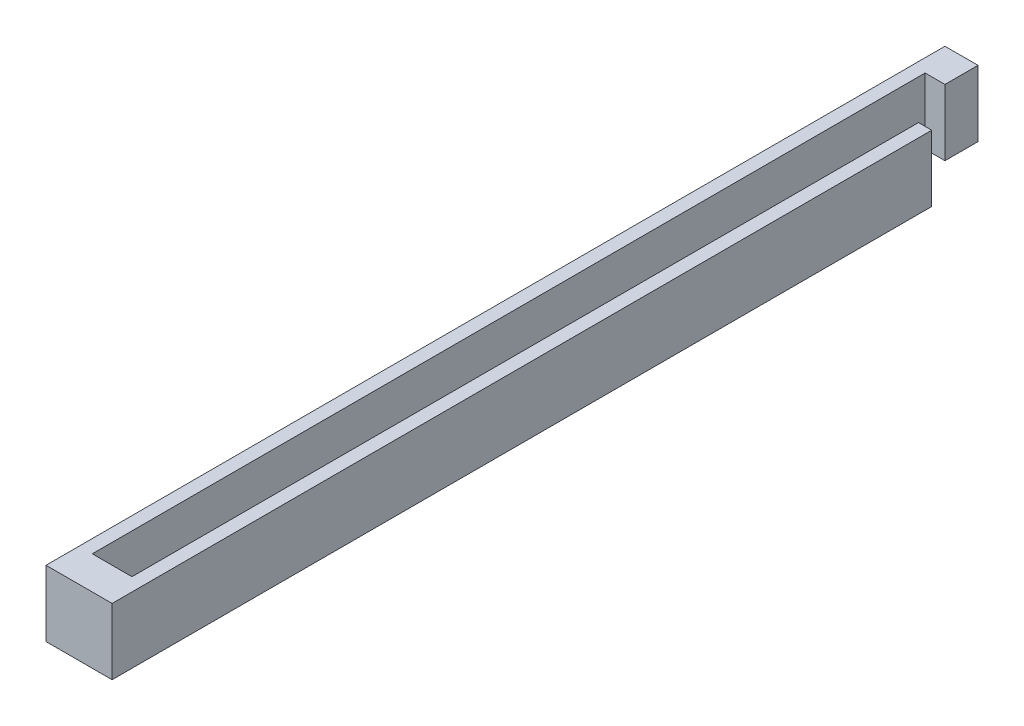
ISO-10303-21;
HEADER;
FILE_DESCRIPTION(('STEP AP214'),'2;1');
FILE_NAME('part.step','',(''),(''),'','','');
FILE_SCHEMA(('AUTOMOTIVE_DESIGN { 1 0 10303 214 1 1 1 1 }'));
ENDSEC;
DATA;
#1=APPLICATION_CONTEXT('core data for automotive mechanical design processes');
#2=APPLICATION_PROTOCOL_DEFINITION('international standard','automotive_design',2000,#1);
#3=PRODUCT_CONTEXT('',#1,'mechanical');
#4=PRODUCT('Part','Part','',(#3));
#5=PRODUCT_RELATED_PRODUCT_CATEGORY('part','',(#4));
#6=PRODUCT_DEFINITION_FORMATION('','',#4);
#7=PRODUCT_DEFINITION_CONTEXT('part definition',#1,'design');
#8=PRODUCT_DEFINITION('design','',#6,#7);
#9=PRODUCT_DEFINITION_SHAPE('','',#8);
#10=(LENGTH_UNIT() NAMED_UNIT(*) SI_UNIT(.MILLI.,.METRE.));
#11=(NAMED_UNIT(*) PLANE_ANGLE_UNIT() SI_UNIT($,.RADIAN.));
#12=(NAMED_UNIT(*) SI_UNIT($,.STERADIAN.) SOLID_ANGLE_UNIT());
#13=UNCERTAINTY_MEASURE_WITH_UNIT(LENGTH_MEASURE(1.E-05),#10,'distance_accuracy_value','');
#14=(GEOMETRIC_REPRESENTATION_CONTEXT(3) GLOBAL_UNCERTAINTY_ASSIGNED_CONTEXT((#13)) GLOBAL_UNIT_ASSIGNED_CONTEXT((#10,
#11,#12)) REPRESENTATION_CONTEXT('',''));
#15=CARTESIAN_POINT('',(0.,0.,0.));
#16=DIRECTION('',(0.,0.,1.));
#17=DIRECTION('',(1.,0.,0.));
#18=AXIS2_PLACEMENT_3D('',#15,#16,#17);
#19=CARTESIAN_POINT('',(5.,10.,-68.));
#20=DIRECTION('',(0.,0.,1.));
#21=DIRECTION('',(1.,0.,0.));
#22=AXIS2_PLACEMENT_3D('',#19,#20,#21);
#23=PLANE('',#22);
#24=DIRECTION('',(0.,-1.,0.));
#25=VECTOR('',#24,1.);
#26=CARTESIAN_POINT('',(0.,10.,-68.));
#27=LINE('',#26,#25);
#28=CARTESIAN_POINT('',(0.,10.,-68.));
#29=VERTEX_POINT('',#28);
#30=CARTESIAN_POINT('',(0.,0.,-68.));
#31=VERTEX_POINT('',#30);
#32=EDGE_CURVE('E164',#29,#31,#27,.T.);
#33=ORIENTED_EDGE('',*,*,#32,.T.);
#34=DIRECTION('',(-1.,0.,0.));
#35=VECTOR('',#34,1.);
#36=CARTESIAN_POINT('',(5.,0.,-68.));
#37=LINE('',#36,#35);
#38=CARTESIAN_POINT('',(-5.,0.,-68.));
#39=VERTEX_POINT('',#38);
#40=EDGE_CURVE('E132',#31,#39,#37,.T.);
#41=ORIENTED_EDGE('',*,*,#40,.T.);
#42=DIRECTION('',(0.,-1.,0.));
#43=VECTOR('',#42,1.);
#44=CARTESIAN_POINT('',(-5.,10.,-68.));
#45=LINE('',#44,#43);
#46=CARTESIAN_POINT('',(-5.,10.,-68.));
#47=VERTEX_POINT('',#46);
#48=EDGE_CURVE('E141',#47,#39,#45,.T.);
#49=ORIENTED_EDGE('',*,*,#48,.F.);
#50=DIRECTION('',(-1.,0.,0.));
#51=VECTOR('',#50,1.);
#52=CARTESIAN_POINT('',(5.,10.,-68.));
#53=LINE('',#52,#51);
#54=EDGE_CURVE('E143',#29,#47,#53,.T.);
#55=ORIENTED_EDGE('',*,*,#54,.F.);
#56=EDGE_LOOP('',(#33,#41,#49,#55));
#57=FACE_BOUND('',#56,.T.);
#58=ADVANCED_FACE('F34',(#57),#23,.F.);
#59=CARTESIAN_POINT('',(0.,10.,0.));
#60=DIRECTION('',(0.,1.,0.));
#61=DIRECTION('',(0.,0.,1.));
#62=AXIS2_PLACEMENT_3D('',#59,#60,#61);
#63=PLANE('',#62);
#64=DIRECTION('',(1.,0.,0.));
#65=VECTOR('',#64,1.);
#66=CARTESIAN_POINT('',(3.,10.,-56.));
#67=LINE('',#66,#65);
#68=CARTESIAN_POINT('',(3.,10.,-56.));
#69=VERTEX_POINT('',#68);
#70=CARTESIAN_POINT('',(5.,10.,-56.));
#71=VERTEX_POINT('',#70);
#72=EDGE_CURVE('E114',#69,#71,#67,.T.);
#73=ORIENTED_EDGE('',*,*,#72,.F.);
#74=DIRECTION('',(0.,0.,-1.));
#75=VECTOR('',#74,1.);
#76=CARTESIAN_POINT('',(3.,10.,63.));
#77=LINE('',#76,#75);
#78=CARTESIAN_POINT('',(3.,10.,63.));
#79=VERTEX_POINT('',#78);
#80=EDGE_CURVE('E195',#79,#69,#77,.T.);
#81=ORIENTED_EDGE('',*,*,#80,.F.);
#82=DIRECTION('',(1.,0.,0.));
#83=VECTOR('',#82,1.);
#84=CARTESIAN_POINT('',(0.,10.,63.));
#85=LINE('',#84,#83);
#86=CARTESIAN_POINT('',(-3.,10.,63.));
#87=VERTEX_POINT('',#86);
#88=EDGE_CURVE('E198',#87,#79,#85,.T.);
#89=ORIENTED_EDGE('',*,*,#88,.F.);
#90=DIRECTION('',(0.,0.,1.));
#91=VECTOR('',#90,1.);
#92=CARTESIAN_POINT('',(-3.,10.,63.));
#93=LINE('',#92,#91);
#94=CARTESIAN_POINT('',(-3.,10.,-63.));
#95=VERTEX_POINT('',#94);
#96=EDGE_CURVE('E186',#95,#87,#93,.T.);
#97=ORIENTED_EDGE('',*,*,#96,.F.);
#98=DIRECTION('',(-1.,0.,0.));
#99=VECTOR('',#98,1.);
#100=CARTESIAN_POINT('',(0.,10.,-63.));
#101=LINE('',#100,#99);
#102=CARTESIAN_POINT('',(0.,10.,-63.));
#103=VERTEX_POINT('',#102);
#104=EDGE_CURVE('E183',#103,#95,#101,.T.);
#105=ORIENTED_EDGE('',*,*,#104,.F.);
#106=DIRECTION('',(0.,0.,1.));
#107=VECTOR('',#106,1.);
#108=CARTESIAN_POINT('',(0.,10.,-63.));
#109=LINE('',#108,#107);
#110=EDGE_CURVE('E193',#29,#103,#109,.T.);
#111=ORIENTED_EDGE('',*,*,#110,.F.);
#112=ORIENTED_EDGE('',*,*,#54,.T.);
#113=DIRECTION('',(0.,0.,1.));
#114=VECTOR('',#113,1.);
#115=CARTESIAN_POINT('',(-5.,10.,68.));
#116=LINE('',#115,#114);
#117=CARTESIAN_POINT('',(-5.,10.,68.));
#118=VERTEX_POINT('',#117);
#119=EDGE_CURVE('E135',#47,#118,#116,.T.);
#120=ORIENTED_EDGE('',*,*,#119,.T.);
#121=DIRECTION('',(1.,0.,0.));
#122=VECTOR('',#121,1.);
#123=CARTESIAN_POINT('',(5.,10.,68.));
#124=LINE('',#123,#122);
#125=CARTESIAN_POINT('',(5.,10.,68.));
#126=VERTEX_POINT('',#125);
#127=EDGE_CURVE('E155',#118,#126,#124,.T.);
#128=ORIENTED_EDGE('',*,*,#127,.T.);
#129=DIRECTION('',(0.,0.,-1.));
#130=VECTOR('',#129,1.);
#131=CARTESIAN_POINT('',(5.,10.,68.));
#132=LINE('',#131,#130);
#133=EDGE_CURVE('E149',#126,#71,#132,.T.);
#134=ORIENTED_EDGE('',*,*,#133,.T.);
#135=EDGE_LOOP('',(#73,#81,#89,#97,#105,#111,#112,#120,#128,#134));
#136=FACE_BOUND('',#135,.T.);
#137=ADVANCED_FACE('F168',(#136),#63,.T.);
#138=CARTESIAN_POINT('',(0.,0.,0.));
#139=DIRECTION('',(0.,1.,0.));
#140=DIRECTION('',(0.,0.,1.));
#141=AXIS2_PLACEMENT_3D('',#138,#139,#140);
#142=PLANE('',#141);
#143=DIRECTION('',(0.,0.,-1.));
#144=VECTOR('',#143,1.);
#145=CARTESIAN_POINT('',(3.,0.,-63.));
#146=LINE('',#145,#144);
#147=CARTESIAN_POINT('',(3.,0.,63.));
#148=VERTEX_POINT('',#147);
#149=CARTESIAN_POINT('',(3.,0.,-56.));
#150=VERTEX_POINT('',#149);
#151=EDGE_CURVE('E127',#148,#150,#146,.T.);
#152=ORIENTED_EDGE('',*,*,#151,.T.);
#153=DIRECTION('',(1.,0.,0.));
#154=VECTOR('',#153,1.);
#155=CARTESIAN_POINT('',(3.,0.,-56.));
#156=LINE('',#155,#154);
#157=CARTESIAN_POINT('',(5.,0.,-56.));
#158=VERTEX_POINT('',#157);
#159=EDGE_CURVE('E49',#150,#158,#156,.T.);
#160=ORIENTED_EDGE('',*,*,#159,.T.);
#161=DIRECTION('',(0.,0.,-1.));
#162=VECTOR('',#161,1.);
#163=CARTESIAN_POINT('',(5.,0.,68.));
#164=LINE('',#163,#162);
#165=CARTESIAN_POINT('',(5.,0.,68.));
#166=VERTEX_POINT('',#165);
#167=EDGE_CURVE('E125',#166,#158,#164,.T.);
#168=ORIENTED_EDGE('',*,*,#167,.F.);
#169=DIRECTION('',(1.,0.,0.));
#170=VECTOR('',#169,1.);
#171=CARTESIAN_POINT('',(5.,0.,68.));
#172=LINE('',#171,#170);
#173=CARTESIAN_POINT('',(-5.,0.,68.));
#174=VERTEX_POINT('',#173);
#175=EDGE_CURVE('E133',#174,#166,#172,.T.);
#176=ORIENTED_EDGE('',*,*,#175,.F.);
#177=DIRECTION('',(0.,0.,1.));
#178=VECTOR('',#177,1.);
#179=CARTESIAN_POINT('',(-5.,0.,68.));
#180=LINE('',#179,#178);
#181=EDGE_CURVE('E137',#39,#174,#180,.T.);
#182=ORIENTED_EDGE('',*,*,#181,.F.);
#183=ORIENTED_EDGE('',*,*,#40,.F.);
#184=DIRECTION('',(0.,0.,1.));
#185=VECTOR('',#184,1.);
#186=CARTESIAN_POINT('',(0.,0.,-63.));
#187=LINE('',#186,#185);
#188=CARTESIAN_POINT('',(0.,0.,-63.));
#189=VERTEX_POINT('',#188);
#190=EDGE_CURVE('E174',#31,#189,#187,.T.);
#191=ORIENTED_EDGE('',*,*,#190,.T.);
#192=DIRECTION('',(-1.,0.,0.));
#193=VECTOR('',#192,1.);
#194=CARTESIAN_POINT('',(0.,0.,-63.));
#195=LINE('',#194,#193);
#196=CARTESIAN_POINT('',(-3.,0.,-63.));
#197=VERTEX_POINT('',#196);
#198=EDGE_CURVE('E184',#189,#197,#195,.T.);
#199=ORIENTED_EDGE('',*,*,#198,.T.);
#200=DIRECTION('',(0.,0.,1.));
#201=VECTOR('',#200,1.);
#202=CARTESIAN_POINT('',(-3.,0.,63.));
#203=LINE('',#202,#201);
#204=CARTESIAN_POINT('',(-3.,0.,63.));
#205=VERTEX_POINT('',#204);
#206=EDGE_CURVE('E57',#197,#205,#203,.T.);
#207=ORIENTED_EDGE('',*,*,#206,.T.);
#208=DIRECTION('',(1.,0.,0.));
#209=VECTOR('',#208,1.);
#210=CARTESIAN_POINT('',(0.,0.,63.));
#211=LINE('',#210,#209);
#212=EDGE_CURVE('E189',#205,#148,#211,.T.);
#213=ORIENTED_EDGE('',*,*,#212,.T.);
#214=EDGE_LOOP('',(#152,#160,#168,#176,#182,#183,#191,#199,#207,#213));
#215=FACE_BOUND('',#214,.T.);
#216=ADVANCED_FACE('F124',(#215),#142,.F.);
#217=CARTESIAN_POINT('',(-5.,10.,68.));
#218=DIRECTION('',(1.,0.,0.));
#219=DIRECTION('',(0.,0.,-1.));
#220=AXIS2_PLACEMENT_3D('',#217,#218,#219);
#221=PLANE('',#220);
#222=ORIENTED_EDGE('',*,*,#181,.T.);
#223=DIRECTION('',(0.,-1.,0.));
#224=VECTOR('',#223,1.);
#225=CARTESIAN_POINT('',(-5.,10.,68.));
#226=LINE('',#225,#224);
#227=EDGE_CURVE('E11',#118,#174,#226,.T.);
#228=ORIENTED_EDGE('',*,*,#227,.F.);
#229=ORIENTED_EDGE('',*,*,#119,.F.);
#230=ORIENTED_EDGE('',*,*,#48,.T.);
#231=EDGE_LOOP('',(#222,#228,#229,#230));
#232=FACE_BOUND('',#231,.T.);
#233=ADVANCED_FACE('F36',(#232),#221,.F.);
#234=CARTESIAN_POINT('',(5.,10.,68.));
#235=DIRECTION('',(0.,0.,-1.));
#236=DIRECTION('',(-1.,0.,0.));
#237=AXIS2_PLACEMENT_3D('',#234,#235,#236);
#238=PLANE('',#237);
#239=ORIENTED_EDGE('',*,*,#175,.T.);
#240=DIRECTION('',(0.,-1.,0.));
#241=VECTOR('',#240,1.);
#242=CARTESIAN_POINT('',(5.,10.,68.));
#243=LINE('',#242,#241);
#244=EDGE_CURVE('E42',#126,#166,#243,.T.);
#245=ORIENTED_EDGE('',*,*,#244,.F.);
#246=ORIENTED_EDGE('',*,*,#127,.F.);
#247=ORIENTED_EDGE('',*,*,#227,.T.);
#248=EDGE_LOOP('',(#239,#245,#246,#247));
#249=FACE_BOUND('',#248,.T.);
#250=ADVANCED_FACE('F170',(#249),#238,.F.);
#251=CARTESIAN_POINT('',(5.,10.,68.));
#252=DIRECTION('',(-1.,0.,0.));
#253=DIRECTION('',(0.,0.,1.));
#254=AXIS2_PLACEMENT_3D('',#251,#252,#253);
#255=PLANE('',#254);
#256=ORIENTED_EDGE('',*,*,#167,.T.);
#257=DIRECTION('',(0.,1.,0.));
#258=VECTOR('',#257,1.);
#259=CARTESIAN_POINT('',(5.,0.,-56.));
#260=LINE('',#259,#258);
#261=EDGE_CURVE('E111',#158,#71,#260,.T.);
#262=ORIENTED_EDGE('',*,*,#261,.T.);
#263=ORIENTED_EDGE('',*,*,#133,.F.);
#264=ORIENTED_EDGE('',*,*,#244,.T.);
#265=EDGE_LOOP('',(#256,#262,#263,#264));
#266=FACE_BOUND('',#265,.T.);
#267=ADVANCED_FACE('F130',(#266),#255,.F.);
#268=CARTESIAN_POINT('',(-3.,10.,63.));
#269=DIRECTION('',(1.,0.,0.));
#270=DIRECTION('',(0.,0.,-1.));
#271=AXIS2_PLACEMENT_3D('',#268,#269,#270);
#272=PLANE('',#271);
#273=ORIENTED_EDGE('',*,*,#206,.F.);
#274=DIRECTION('',(0.,-1.,0.));
#275=VECTOR('',#274,1.);
#276=CARTESIAN_POINT('',(-3.,10.,-63.));
#277=LINE('',#276,#275);
#278=EDGE_CURVE('E179',#95,#197,#277,.T.);
#279=ORIENTED_EDGE('',*,*,#278,.F.);
#280=ORIENTED_EDGE('',*,*,#96,.T.);
#281=DIRECTION('',(0.,-1.,0.));
#282=VECTOR('',#281,1.);
#283=CARTESIAN_POINT('',(-3.,10.,63.));
#284=LINE('',#283,#282);
#285=EDGE_CURVE('E158',#87,#205,#284,.T.);
#286=ORIENTED_EDGE('',*,*,#285,.T.);
#287=EDGE_LOOP('',(#273,#279,#280,#286));
#288=FACE_BOUND('',#287,.T.);
#289=ADVANCED_FACE('F215',(#288),#272,.T.);
#290=CARTESIAN_POINT('',(0.,10.,63.));
#291=DIRECTION('',(0.,0.,-1.));
#292=DIRECTION('',(-1.,0.,0.));
#293=AXIS2_PLACEMENT_3D('',#290,#291,#292);
#294=PLANE('',#293);
#295=ORIENTED_EDGE('',*,*,#212,.F.);
#296=ORIENTED_EDGE('',*,*,#285,.F.);
#297=ORIENTED_EDGE('',*,*,#88,.T.);
#298=DIRECTION('',(0.,-1.,0.));
#299=VECTOR('',#298,1.);
#300=CARTESIAN_POINT('',(3.,10.,63.));
#301=LINE('',#300,#299);
#302=EDGE_CURVE('E160',#79,#148,#301,.T.);
#303=ORIENTED_EDGE('',*,*,#302,.T.);
#304=EDGE_LOOP('',(#295,#296,#297,#303));
#305=FACE_BOUND('',#304,.T.);
#306=ADVANCED_FACE('F208',(#305),#294,.T.);
#307=CARTESIAN_POINT('',(3.,10.,-63.));
#308=DIRECTION('',(-1.,0.,0.));
#309=DIRECTION('',(0.,0.,1.));
#310=AXIS2_PLACEMENT_3D('',#307,#308,#309);
#311=PLANE('',#310);
#312=DIRECTION('',(0.,1.,0.));
#313=VECTOR('',#312,1.);
#314=CARTESIAN_POINT('',(3.,0.,-56.));
#315=LINE('',#314,#313);
#316=EDGE_CURVE('E119',#150,#69,#315,.T.);
#317=ORIENTED_EDGE('',*,*,#316,.F.);
#318=ORIENTED_EDGE('',*,*,#151,.F.);
#319=ORIENTED_EDGE('',*,*,#302,.F.);
#320=ORIENTED_EDGE('',*,*,#80,.T.);
#321=EDGE_LOOP('',(#317,#318,#319,#320));
#322=FACE_BOUND('',#321,.T.);
#323=ADVANCED_FACE('F206',(#322),#311,.T.);
#324=CARTESIAN_POINT('',(0.,10.,-63.));
#325=DIRECTION('',(1.,0.,0.));
#326=DIRECTION('',(0.,0.,-1.));
#327=AXIS2_PLACEMENT_3D('',#324,#325,#326);
#328=PLANE('',#327);
#329=ORIENTED_EDGE('',*,*,#190,.F.);
#330=ORIENTED_EDGE('',*,*,#32,.F.);
#331=ORIENTED_EDGE('',*,*,#110,.T.);
#332=DIRECTION('',(0.,-1.,0.));
#333=VECTOR('',#332,1.);
#334=CARTESIAN_POINT('',(0.,10.,-63.));
#335=LINE('',#334,#333);
#336=EDGE_CURVE('E178',#103,#189,#335,.T.);
#337=ORIENTED_EDGE('',*,*,#336,.T.);
#338=EDGE_LOOP('',(#329,#330,#331,#337));
#339=FACE_BOUND('',#338,.T.);
#340=ADVANCED_FACE('F216',(#339),#328,.T.);
#341=CARTESIAN_POINT('',(0.,10.,-63.));
#342=DIRECTION('',(0.,0.,1.));
#343=DIRECTION('',(1.,0.,0.));
#344=AXIS2_PLACEMENT_3D('',#341,#342,#343);
#345=PLANE('',#344);
#346=ORIENTED_EDGE('',*,*,#198,.F.);
#347=ORIENTED_EDGE('',*,*,#336,.F.);
#348=ORIENTED_EDGE('',*,*,#104,.T.);
#349=ORIENTED_EDGE('',*,*,#278,.T.);
#350=EDGE_LOOP('',(#346,#347,#348,#349));
#351=FACE_BOUND('',#350,.T.);
#352=ADVANCED_FACE('F212',(#351),#345,.T.);
#353=CARTESIAN_POINT('',(3.,0.,-56.));
#354=DIRECTION('',(0.,0.,1.));
#355=DIRECTION('',(1.,0.,0.));
#356=AXIS2_PLACEMENT_3D('',#353,#354,#355);
#357=PLANE('',#356);
#358=ORIENTED_EDGE('',*,*,#72,.T.);
#359=ORIENTED_EDGE('',*,*,#261,.F.);
#360=ORIENTED_EDGE('',*,*,#159,.F.);
#361=ORIENTED_EDGE('',*,*,#316,.T.);
#362=EDGE_LOOP('',(#358,#359,#360,#361));
#363=FACE_BOUND('',#362,.T.);
#364=ADVANCED_FACE('F112',(#363),#357,.F.);
#365=CLOSED_SHELL('',(#58,#137,#216,#233,#250,#267,#289,#306,#323,#340,#352,#364));
#366=MANIFOLD_SOLID_BREP('B2',#365);
#367=ADVANCED_BREP_SHAPE_REPRESENTATION('',(#18,#366),#14);
#368=SHAPE_DEFINITION_REPRESENTATION(#9,#367);
ENDSEC;
END-ISO-10303-21;
